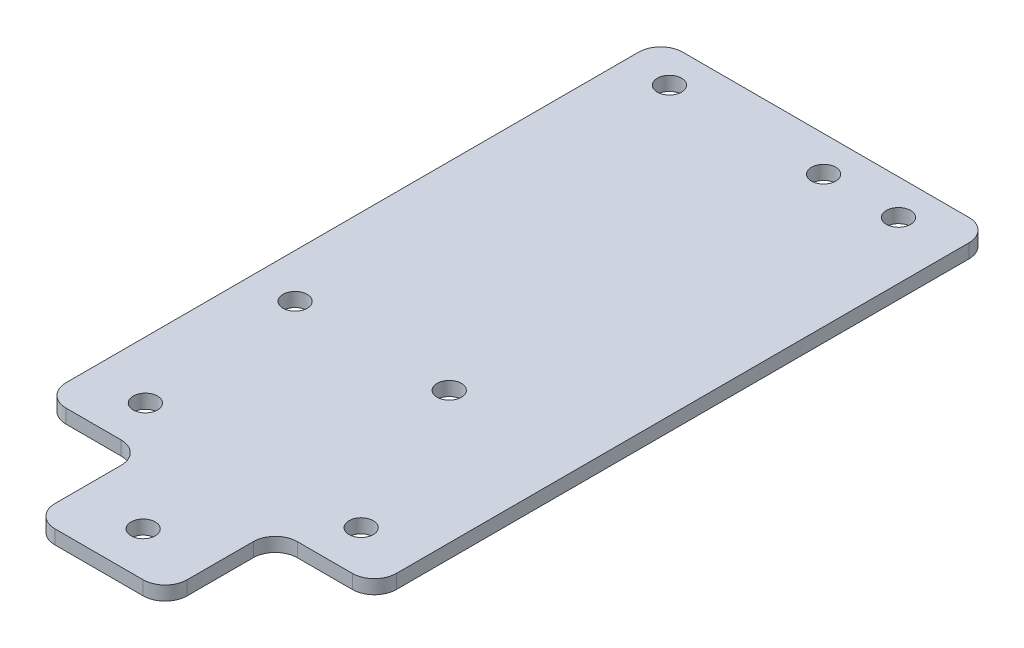
ISO-10303-21;
HEADER;
FILE_DESCRIPTION(('STEP AP214'),'2;1');
FILE_NAME('part.step','',(''),(''),'','','');
FILE_SCHEMA(('AUTOMOTIVE_DESIGN { 1 0 10303 214 1 1 1 1 }'));
ENDSEC;
DATA;
#1=APPLICATION_CONTEXT('core data for automotive mechanical design processes');
#2=APPLICATION_PROTOCOL_DEFINITION('international standard','automotive_design',2000,#1);
#3=PRODUCT_CONTEXT('',#1,'mechanical');
#4=PRODUCT('Part','Part','',(#3));
#5=PRODUCT_RELATED_PRODUCT_CATEGORY('part','',(#4));
#6=PRODUCT_DEFINITION_FORMATION('','',#4);
#7=PRODUCT_DEFINITION_CONTEXT('part definition',#1,'design');
#8=PRODUCT_DEFINITION('design','',#6,#7);
#9=PRODUCT_DEFINITION_SHAPE('','',#8);
#10=(LENGTH_UNIT() NAMED_UNIT(*) SI_UNIT(.MILLI.,.METRE.));
#11=(NAMED_UNIT(*) PLANE_ANGLE_UNIT() SI_UNIT($,.RADIAN.));
#12=(NAMED_UNIT(*) SI_UNIT($,.STERADIAN.) SOLID_ANGLE_UNIT());
#13=UNCERTAINTY_MEASURE_WITH_UNIT(LENGTH_MEASURE(1.E-05),#10,'distance_accuracy_value','');
#14=(GEOMETRIC_REPRESENTATION_CONTEXT(3) GLOBAL_UNCERTAINTY_ASSIGNED_CONTEXT((#13)) GLOBAL_UNIT_ASSIGNED_CONTEXT((#10,
#11,#12)) REPRESENTATION_CONTEXT('',''));
#15=CARTESIAN_POINT('',(0.,0.,0.));
#16=DIRECTION('',(0.,0.,1.));
#17=DIRECTION('',(1.,0.,0.));
#18=AXIS2_PLACEMENT_3D('',#15,#16,#17);
#19=CARTESIAN_POINT('',(70.,3.175,135.));
#20=DIRECTION('',(0.,1.,0.));
#21=DIRECTION('',(0.,0.,1.));
#22=AXIS2_PLACEMENT_3D('',#19,#20,#21);
#23=PLANE('',#22);
#24=CARTESIAN_POINT('',(62.,3.175,130.));
#25=DIRECTION('',(0.,1.,0.));
#26=DIRECTION('',(0.,0.,1.));
#27=AXIS2_PLACEMENT_3D('',#24,#25,#26);
#28=CIRCLE('',#27,2.75);
#29=CARTESIAN_POINT('',(62.,3.175,132.75));
#30=VERTEX_POINT('',#29);
#31=EDGE_CURVE('E368',#30,#30,#28,.T.);
#32=ORIENTED_EDGE('',*,*,#31,.F.);
#33=EDGE_LOOP('',(#32));
#34=FACE_BOUND('',#33,.T.);
#35=CARTESIAN_POINT('',(10.,3.175,93.));
#36=DIRECTION('',(0.,1.,0.));
#37=DIRECTION('',(0.,0.,-1.));
#38=AXIS2_PLACEMENT_3D('',#35,#36,#37);
#39=CIRCLE('',#38,2.75);
#40=CARTESIAN_POINT('',(10.,3.175,90.25));
#41=VERTEX_POINT('',#40);
#42=EDGE_CURVE('E381',#41,#41,#39,.T.);
#43=ORIENTED_EDGE('',*,*,#42,.F.);
#44=EDGE_LOOP('',(#43));
#45=FACE_BOUND('',#44,.T.);
#46=CARTESIAN_POINT('',(62.,3.175,8.));
#47=DIRECTION('',(0.,1.,0.));
#48=DIRECTION('',(0.,0.,1.));
#49=AXIS2_PLACEMENT_3D('',#46,#47,#48);
#50=CIRCLE('',#49,2.75000000000002);
#51=CARTESIAN_POINT('',(62.,3.175,10.75));
#52=VERTEX_POINT('',#51);
#53=EDGE_CURVE('E395',#52,#52,#50,.T.);
#54=ORIENTED_EDGE('',*,*,#53,.F.);
#55=EDGE_LOOP('',(#54));
#56=FACE_BOUND('',#55,.T.);
#57=CARTESIAN_POINT('',(10.,3.175,8.));
#58=DIRECTION('',(0.,1.,0.));
#59=DIRECTION('',(0.,0.,1.));
#60=AXIS2_PLACEMENT_3D('',#57,#58,#59);
#61=CIRCLE('',#60,2.75);
#62=CARTESIAN_POINT('',(10.,3.175,10.75));
#63=VERTEX_POINT('',#62);
#64=EDGE_CURVE('E188',#63,#63,#61,.T.);
#65=ORIENTED_EDGE('',*,*,#64,.F.);
#66=EDGE_LOOP('',(#65));
#67=FACE_BOUND('',#66,.T.);
#68=CARTESIAN_POINT('',(70.,3.175,135.));
#69=DIRECTION('',(0.,1.,0.));
#70=DIRECTION('',(0.,0.,1.));
#71=AXIS2_PLACEMENT_3D('',#68,#69,#70);
#72=CIRCLE('',#71,5.);
#73=CARTESIAN_POINT('',(70.,3.175,140.));
#74=VERTEX_POINT('',#73);
#75=CARTESIAN_POINT('',(75.,3.175,135.));
#76=VERTEX_POINT('',#75);
#77=EDGE_CURVE('E216',#74,#76,#72,.T.);
#78=ORIENTED_EDGE('',*,*,#77,.T.);
#79=DIRECTION('',(0.,0.,-1.));
#80=VECTOR('',#79,1.);
#81=CARTESIAN_POINT('',(75.,3.175,5.00000000000003));
#82=LINE('',#81,#80);
#83=CARTESIAN_POINT('',(75.,3.175,5.00000000000004));
#84=VERTEX_POINT('',#83);
#85=EDGE_CURVE('E123',#76,#84,#82,.T.);
#86=ORIENTED_EDGE('',*,*,#85,.T.);
#87=CARTESIAN_POINT('',(70.,3.175,5.));
#88=DIRECTION('',(0.,1.,0.));
#89=DIRECTION('',(0.,0.,-1.));
#90=AXIS2_PLACEMENT_3D('',#87,#88,#89);
#91=CIRCLE('',#90,5.);
#92=CARTESIAN_POINT('',(70.,3.175,0.));
#93=VERTEX_POINT('',#92);
#94=EDGE_CURVE('E255',#84,#93,#91,.T.);
#95=ORIENTED_EDGE('',*,*,#94,.T.);
#96=DIRECTION('',(-1.,0.,0.));
#97=VECTOR('',#96,1.);
#98=CARTESIAN_POINT('',(5.00000000000004,3.175,0.));
#99=LINE('',#98,#97);
#100=CARTESIAN_POINT('',(5.00000000000004,3.175,0.));
#101=VERTEX_POINT('',#100);
#102=EDGE_CURVE('E274',#93,#101,#99,.T.);
#103=ORIENTED_EDGE('',*,*,#102,.T.);
#104=CARTESIAN_POINT('',(5.,3.175,5.));
#105=DIRECTION('',(0.,1.,0.));
#106=DIRECTION('',(0.,0.,1.));
#107=AXIS2_PLACEMENT_3D('',#104,#105,#106);
#108=CIRCLE('',#107,5.);
#109=CARTESIAN_POINT('',(0.,3.175,5.00000000000004));
#110=VERTEX_POINT('',#109);
#111=EDGE_CURVE('E271',#101,#110,#108,.T.);
#112=ORIENTED_EDGE('',*,*,#111,.T.);
#113=DIRECTION('',(0.,0.,1.));
#114=VECTOR('',#113,1.);
#115=CARTESIAN_POINT('',(0.,3.175,5.00000000000004));
#116=LINE('',#115,#114);
#117=CARTESIAN_POINT('',(0.,3.175,135.));
#118=VERTEX_POINT('',#117);
#119=EDGE_CURVE('E273',#110,#118,#116,.T.);
#120=ORIENTED_EDGE('',*,*,#119,.T.);
#121=CARTESIAN_POINT('',(5.00000000000002,3.175,135.));
#122=DIRECTION('',(0.,1.,0.));
#123=DIRECTION('',(0.,0.,1.));
#124=AXIS2_PLACEMENT_3D('',#121,#122,#123);
#125=CIRCLE('',#124,5.);
#126=CARTESIAN_POINT('',(5.00000000000002,3.175,140.));
#127=VERTEX_POINT('',#126);
#128=EDGE_CURVE('E276',#118,#127,#125,.T.);
#129=ORIENTED_EDGE('',*,*,#128,.T.);
#130=DIRECTION('',(1.,0.,0.));
#131=VECTOR('',#130,1.);
#132=CARTESIAN_POINT('',(5.00000000000002,3.175,140.));
#133=LINE('',#132,#131);
#134=CARTESIAN_POINT('',(17.5,3.175,140.));
#135=VERTEX_POINT('',#134);
#136=EDGE_CURVE('E282',#127,#135,#133,.T.);
#137=ORIENTED_EDGE('',*,*,#136,.T.);
#138=CARTESIAN_POINT('',(17.5,3.175,145.));
#139=DIRECTION('',(0.,-1.,0.));
#140=DIRECTION('',(0.,0.,-1.));
#141=AXIS2_PLACEMENT_3D('',#138,#139,#140);
#142=CIRCLE('',#141,5.);
#143=CARTESIAN_POINT('',(22.5,3.175,145.));
#144=VERTEX_POINT('',#143);
#145=EDGE_CURVE('E284',#135,#144,#142,.T.);
#146=ORIENTED_EDGE('',*,*,#145,.T.);
#147=DIRECTION('',(0.,0.,1.));
#148=VECTOR('',#147,1.);
#149=CARTESIAN_POINT('',(22.5,3.175,145.));
#150=LINE('',#149,#148);
#151=CARTESIAN_POINT('',(22.5,3.175,160.));
#152=VERTEX_POINT('',#151);
#153=EDGE_CURVE('E286',#144,#152,#150,.T.);
#154=ORIENTED_EDGE('',*,*,#153,.T.);
#155=CARTESIAN_POINT('',(27.5,3.175,160.));
#156=DIRECTION('',(0.,1.,0.));
#157=DIRECTION('',(0.,0.,1.));
#158=AXIS2_PLACEMENT_3D('',#155,#156,#157);
#159=CIRCLE('',#158,5.);
#160=CARTESIAN_POINT('',(27.5,3.175,165.));
#161=VERTEX_POINT('',#160);
#162=EDGE_CURVE('E288',#152,#161,#159,.T.);
#163=ORIENTED_EDGE('',*,*,#162,.T.);
#164=DIRECTION('',(1.,0.,0.));
#165=VECTOR('',#164,1.);
#166=CARTESIAN_POINT('',(27.5,3.175,165.));
#167=LINE('',#166,#165);
#168=CARTESIAN_POINT('',(47.5,3.175,165.));
#169=VERTEX_POINT('',#168);
#170=EDGE_CURVE('E290',#161,#169,#167,.T.);
#171=ORIENTED_EDGE('',*,*,#170,.T.);
#172=CARTESIAN_POINT('',(47.5,3.175,160.));
#173=DIRECTION('',(0.,1.,0.));
#174=DIRECTION('',(0.,0.,1.));
#175=AXIS2_PLACEMENT_3D('',#172,#173,#174);
#176=CIRCLE('',#175,5.);
#177=CARTESIAN_POINT('',(52.5,3.175,160.));
#178=VERTEX_POINT('',#177);
#179=EDGE_CURVE('E166',#169,#178,#176,.T.);
#180=ORIENTED_EDGE('',*,*,#179,.T.);
#181=DIRECTION('',(0.,0.,-1.));
#182=VECTOR('',#181,1.);
#183=CARTESIAN_POINT('',(52.5,3.175,145.));
#184=LINE('',#183,#182);
#185=CARTESIAN_POINT('',(52.5,3.175,145.));
#186=VERTEX_POINT('',#185);
#187=EDGE_CURVE('E160',#178,#186,#184,.T.);
#188=ORIENTED_EDGE('',*,*,#187,.T.);
#189=CARTESIAN_POINT('',(57.5,3.175,145.));
#190=DIRECTION('',(0.,-1.,0.));
#191=DIRECTION('',(0.,0.,1.));
#192=AXIS2_PLACEMENT_3D('',#189,#190,#191);
#193=CIRCLE('',#192,5.);
#194=CARTESIAN_POINT('',(57.5,3.175,140.));
#195=VERTEX_POINT('',#194);
#196=EDGE_CURVE('E164',#186,#195,#193,.T.);
#197=ORIENTED_EDGE('',*,*,#196,.T.);
#198=DIRECTION('',(1.,0.,0.));
#199=VECTOR('',#198,1.);
#200=CARTESIAN_POINT('',(57.5,3.175,140.));
#201=LINE('',#200,#199);
#202=EDGE_CURVE('E56',#195,#74,#201,.T.);
#203=ORIENTED_EDGE('',*,*,#202,.T.);
#204=EDGE_LOOP('',(#78,#86,#95,#103,#112,#120,#129,#137,#146,#154,#163,#171,#180,#188,#197,#203));
#205=FACE_BOUND('',#204,.T.);
#206=CARTESIAN_POINT('',(45.,3.175,8.));
#207=DIRECTION('',(0.,1.,0.));
#208=DIRECTION('',(0.,0.,1.));
#209=AXIS2_PLACEMENT_3D('',#206,#207,#208);
#210=CIRCLE('',#209,2.75);
#211=CARTESIAN_POINT('',(45.,3.175,10.75));
#212=VERTEX_POINT('',#211);
#213=EDGE_CURVE('E402',#212,#212,#210,.T.);
#214=ORIENTED_EDGE('',*,*,#213,.F.);
#215=EDGE_LOOP('',(#214));
#216=FACE_BOUND('',#215,.T.);
#217=CARTESIAN_POINT('',(45.,3.175,93.));
#218=DIRECTION('',(0.,1.,0.));
#219=DIRECTION('',(0.,0.,-1.));
#220=AXIS2_PLACEMENT_3D('',#217,#218,#219);
#221=CIRCLE('',#220,2.75);
#222=CARTESIAN_POINT('',(45.,3.175,90.25));
#223=VERTEX_POINT('',#222);
#224=EDGE_CURVE('E388',#223,#223,#221,.T.);
#225=ORIENTED_EDGE('',*,*,#224,.F.);
#226=EDGE_LOOP('',(#225));
#227=FACE_BOUND('',#226,.T.);
#228=CARTESIAN_POINT('',(37.5,3.175,155.));
#229=DIRECTION('',(0.,1.,0.));
#230=DIRECTION('',(0.,0.,1.));
#231=AXIS2_PLACEMENT_3D('',#228,#229,#230);
#232=CIRCLE('',#231,2.75);
#233=CARTESIAN_POINT('',(37.5,3.175,157.75));
#234=VERTEX_POINT('',#233);
#235=EDGE_CURVE('E375',#234,#234,#232,.T.);
#236=ORIENTED_EDGE('',*,*,#235,.F.);
#237=EDGE_LOOP('',(#236));
#238=FACE_BOUND('',#237,.T.);
#239=CARTESIAN_POINT('',(13.,3.175,130.));
#240=DIRECTION('',(0.,1.,0.));
#241=DIRECTION('',(0.,0.,1.));
#242=AXIS2_PLACEMENT_3D('',#239,#240,#241);
#243=CIRCLE('',#242,2.75);
#244=CARTESIAN_POINT('',(13.,3.175,132.75));
#245=VERTEX_POINT('',#244);
#246=EDGE_CURVE('E357',#245,#245,#243,.T.);
#247=ORIENTED_EDGE('',*,*,#246,.F.);
#248=EDGE_LOOP('',(#247));
#249=FACE_BOUND('',#248,.T.);
#250=ADVANCED_FACE('F39',(#34,#45,#56,#67,#205,#216,#227,#238,#249),#23,.T.);
#251=CARTESIAN_POINT('',(70.,0.,135.));
#252=DIRECTION('',(0.,1.,0.));
#253=DIRECTION('',(0.,0.,1.));
#254=AXIS2_PLACEMENT_3D('',#251,#252,#253);
#255=PLANE('',#254);
#256=CARTESIAN_POINT('',(70.,0.,135.));
#257=DIRECTION('',(0.,1.,0.));
#258=DIRECTION('',(0.,0.,1.));
#259=AXIS2_PLACEMENT_3D('',#256,#257,#258);
#260=CIRCLE('',#259,5.);
#261=CARTESIAN_POINT('',(70.,0.,140.));
#262=VERTEX_POINT('',#261);
#263=CARTESIAN_POINT('',(75.,0.,135.));
#264=VERTEX_POINT('',#263);
#265=EDGE_CURVE('E184',#262,#264,#260,.T.);
#266=ORIENTED_EDGE('',*,*,#265,.F.);
#267=DIRECTION('',(1.,0.,0.));
#268=VECTOR('',#267,1.);
#269=CARTESIAN_POINT('',(57.5,0.,140.));
#270=LINE('',#269,#268);
#271=CARTESIAN_POINT('',(57.5,0.,140.));
#272=VERTEX_POINT('',#271);
#273=EDGE_CURVE('E115',#272,#262,#270,.T.);
#274=ORIENTED_EDGE('',*,*,#273,.F.);
#275=CARTESIAN_POINT('',(57.5,0.,145.));
#276=DIRECTION('',(0.,-1.,0.));
#277=DIRECTION('',(0.,0.,1.));
#278=AXIS2_PLACEMENT_3D('',#275,#276,#277);
#279=CIRCLE('',#278,5.);
#280=CARTESIAN_POINT('',(52.5,0.,145.));
#281=VERTEX_POINT('',#280);
#282=EDGE_CURVE('E109',#281,#272,#279,.T.);
#283=ORIENTED_EDGE('',*,*,#282,.F.);
#284=DIRECTION('',(0.,0.,-1.));
#285=VECTOR('',#284,1.);
#286=CARTESIAN_POINT('',(52.5,0.,145.));
#287=LINE('',#286,#285);
#288=CARTESIAN_POINT('',(52.5,0.,160.));
#289=VERTEX_POINT('',#288);
#290=EDGE_CURVE('E174',#289,#281,#287,.T.);
#291=ORIENTED_EDGE('',*,*,#290,.F.);
#292=CARTESIAN_POINT('',(47.5,0.,160.));
#293=DIRECTION('',(0.,1.,0.));
#294=DIRECTION('',(0.,0.,1.));
#295=AXIS2_PLACEMENT_3D('',#292,#293,#294);
#296=CIRCLE('',#295,5.);
#297=CARTESIAN_POINT('',(47.5,0.,165.));
#298=VERTEX_POINT('',#297);
#299=EDGE_CURVE('E211',#298,#289,#296,.T.);
#300=ORIENTED_EDGE('',*,*,#299,.F.);
#301=DIRECTION('',(1.,0.,0.));
#302=VECTOR('',#301,1.);
#303=CARTESIAN_POINT('',(27.5,0.,165.));
#304=LINE('',#303,#302);
#305=CARTESIAN_POINT('',(27.5,0.,165.));
#306=VERTEX_POINT('',#305);
#307=EDGE_CURVE('E209',#306,#298,#304,.T.);
#308=ORIENTED_EDGE('',*,*,#307,.F.);
#309=CARTESIAN_POINT('',(27.5,0.,160.));
#310=DIRECTION('',(0.,1.,0.));
#311=DIRECTION('',(0.,0.,1.));
#312=AXIS2_PLACEMENT_3D('',#309,#310,#311);
#313=CIRCLE('',#312,5.);
#314=CARTESIAN_POINT('',(22.5,0.,160.));
#315=VERTEX_POINT('',#314);
#316=EDGE_CURVE('E207',#315,#306,#313,.T.);
#317=ORIENTED_EDGE('',*,*,#316,.F.);
#318=DIRECTION('',(0.,0.,1.));
#319=VECTOR('',#318,1.);
#320=CARTESIAN_POINT('',(22.5,0.,145.));
#321=LINE('',#320,#319);
#322=CARTESIAN_POINT('',(22.5,0.,145.));
#323=VERTEX_POINT('',#322);
#324=EDGE_CURVE('E205',#323,#315,#321,.T.);
#325=ORIENTED_EDGE('',*,*,#324,.F.);
#326=CARTESIAN_POINT('',(17.5,0.,145.));
#327=DIRECTION('',(0.,-1.,0.));
#328=DIRECTION('',(0.,0.,-1.));
#329=AXIS2_PLACEMENT_3D('',#326,#327,#328);
#330=CIRCLE('',#329,5.);
#331=CARTESIAN_POINT('',(17.5,0.,140.));
#332=VERTEX_POINT('',#331);
#333=EDGE_CURVE('E203',#332,#323,#330,.T.);
#334=ORIENTED_EDGE('',*,*,#333,.F.);
#335=DIRECTION('',(1.,0.,0.));
#336=VECTOR('',#335,1.);
#337=CARTESIAN_POINT('',(5.00000000000002,0.,140.));
#338=LINE('',#337,#336);
#339=CARTESIAN_POINT('',(5.00000000000002,0.,140.));
#340=VERTEX_POINT('',#339);
#341=EDGE_CURVE('E199',#340,#332,#338,.T.);
#342=ORIENTED_EDGE('',*,*,#341,.F.);
#343=CARTESIAN_POINT('',(5.00000000000002,0.,135.));
#344=DIRECTION('',(0.,1.,0.));
#345=DIRECTION('',(0.,0.,1.));
#346=AXIS2_PLACEMENT_3D('',#343,#344,#345);
#347=CIRCLE('',#346,5.);
#348=CARTESIAN_POINT('',(0.,0.,135.));
#349=VERTEX_POINT('',#348);
#350=EDGE_CURVE('E198',#349,#340,#347,.T.);
#351=ORIENTED_EDGE('',*,*,#350,.F.);
#352=DIRECTION('',(0.,0.,1.));
#353=VECTOR('',#352,1.);
#354=CARTESIAN_POINT('',(0.,0.,5.00000000000004));
#355=LINE('',#354,#353);
#356=CARTESIAN_POINT('',(0.,0.,5.00000000000004));
#357=VERTEX_POINT('',#356);
#358=EDGE_CURVE('E196',#357,#349,#355,.T.);
#359=ORIENTED_EDGE('',*,*,#358,.F.);
#360=CARTESIAN_POINT('',(5.,0.,5.));
#361=DIRECTION('',(0.,1.,0.));
#362=DIRECTION('',(0.,0.,1.));
#363=AXIS2_PLACEMENT_3D('',#360,#361,#362);
#364=CIRCLE('',#363,5.);
#365=CARTESIAN_POINT('',(5.00000000000004,0.,0.));
#366=VERTEX_POINT('',#365);
#367=EDGE_CURVE('E194',#366,#357,#364,.T.);
#368=ORIENTED_EDGE('',*,*,#367,.F.);
#369=DIRECTION('',(-1.,0.,0.));
#370=VECTOR('',#369,1.);
#371=CARTESIAN_POINT('',(5.00000000000004,0.,0.));
#372=LINE('',#371,#370);
#373=CARTESIAN_POINT('',(70.,0.,0.));
#374=VERTEX_POINT('',#373);
#375=EDGE_CURVE('E192',#374,#366,#372,.T.);
#376=ORIENTED_EDGE('',*,*,#375,.F.);
#377=CARTESIAN_POINT('',(70.,0.,5.));
#378=DIRECTION('',(0.,1.,0.));
#379=DIRECTION('',(0.,0.,-1.));
#380=AXIS2_PLACEMENT_3D('',#377,#378,#379);
#381=CIRCLE('',#380,5.);
#382=CARTESIAN_POINT('',(75.,0.,5.00000000000004));
#383=VERTEX_POINT('',#382);
#384=EDGE_CURVE('E190',#383,#374,#381,.T.);
#385=ORIENTED_EDGE('',*,*,#384,.F.);
#386=DIRECTION('',(0.,0.,-1.));
#387=VECTOR('',#386,1.);
#388=CARTESIAN_POINT('',(75.,0.,5.00000000000003));
#389=LINE('',#388,#387);
#390=EDGE_CURVE('E187',#264,#383,#389,.T.);
#391=ORIENTED_EDGE('',*,*,#390,.F.);
#392=EDGE_LOOP('',(#266,#274,#283,#291,#300,#308,#317,#325,#334,#342,#351,#359,#368,#376,#385,#391));
#393=FACE_BOUND('',#392,.T.);
#394=CARTESIAN_POINT('',(10.,0.,8.));
#395=DIRECTION('',(0.,1.,0.));
#396=DIRECTION('',(0.,0.,1.));
#397=AXIS2_PLACEMENT_3D('',#394,#395,#396);
#398=CIRCLE('',#397,2.75);
#399=CARTESIAN_POINT('',(10.,0.,10.75));
#400=VERTEX_POINT('',#399);
#401=EDGE_CURVE('E405',#400,#400,#398,.T.);
#402=ORIENTED_EDGE('',*,*,#401,.T.);
#403=EDGE_LOOP('',(#402));
#404=FACE_BOUND('',#403,.T.);
#405=CARTESIAN_POINT('',(45.,0.,8.));
#406=DIRECTION('',(0.,1.,0.));
#407=DIRECTION('',(0.,0.,1.));
#408=AXIS2_PLACEMENT_3D('',#405,#406,#407);
#409=CIRCLE('',#408,2.75);
#410=CARTESIAN_POINT('',(45.,0.,10.75));
#411=VERTEX_POINT('',#410);
#412=EDGE_CURVE('E398',#411,#411,#409,.T.);
#413=ORIENTED_EDGE('',*,*,#412,.T.);
#414=EDGE_LOOP('',(#413));
#415=FACE_BOUND('',#414,.T.);
#416=CARTESIAN_POINT('',(62.,0.,8.));
#417=DIRECTION('',(0.,1.,0.));
#418=DIRECTION('',(0.,0.,1.));
#419=AXIS2_PLACEMENT_3D('',#416,#417,#418);
#420=CIRCLE('',#419,2.75000000000002);
#421=CARTESIAN_POINT('',(62.,0.,10.75));
#422=VERTEX_POINT('',#421);
#423=EDGE_CURVE('E391',#422,#422,#420,.T.);
#424=ORIENTED_EDGE('',*,*,#423,.T.);
#425=EDGE_LOOP('',(#424));
#426=FACE_BOUND('',#425,.T.);
#427=CARTESIAN_POINT('',(45.,0.,93.));
#428=DIRECTION('',(0.,1.,0.));
#429=DIRECTION('',(0.,0.,-1.));
#430=AXIS2_PLACEMENT_3D('',#427,#428,#429);
#431=CIRCLE('',#430,2.75);
#432=CARTESIAN_POINT('',(45.,0.,90.25));
#433=VERTEX_POINT('',#432);
#434=EDGE_CURVE('E384',#433,#433,#431,.T.);
#435=ORIENTED_EDGE('',*,*,#434,.T.);
#436=EDGE_LOOP('',(#435));
#437=FACE_BOUND('',#436,.T.);
#438=CARTESIAN_POINT('',(10.,0.,93.));
#439=DIRECTION('',(0.,1.,0.));
#440=DIRECTION('',(0.,0.,-1.));
#441=AXIS2_PLACEMENT_3D('',#438,#439,#440);
#442=CIRCLE('',#441,2.75);
#443=CARTESIAN_POINT('',(10.,0.,90.25));
#444=VERTEX_POINT('',#443);
#445=EDGE_CURVE('E378',#444,#444,#442,.T.);
#446=ORIENTED_EDGE('',*,*,#445,.T.);
#447=EDGE_LOOP('',(#446));
#448=FACE_BOUND('',#447,.T.);
#449=CARTESIAN_POINT('',(37.5,0.,155.));
#450=DIRECTION('',(0.,1.,0.));
#451=DIRECTION('',(0.,0.,1.));
#452=AXIS2_PLACEMENT_3D('',#449,#450,#451);
#453=CIRCLE('',#452,2.75);
#454=CARTESIAN_POINT('',(37.5,0.,157.75));
#455=VERTEX_POINT('',#454);
#456=EDGE_CURVE('E371',#455,#455,#453,.T.);
#457=ORIENTED_EDGE('',*,*,#456,.T.);
#458=EDGE_LOOP('',(#457));
#459=FACE_BOUND('',#458,.T.);
#460=CARTESIAN_POINT('',(62.,0.,130.));
#461=DIRECTION('',(0.,1.,0.));
#462=DIRECTION('',(0.,0.,1.));
#463=AXIS2_PLACEMENT_3D('',#460,#461,#462);
#464=CIRCLE('',#463,2.75);
#465=CARTESIAN_POINT('',(62.,0.,132.75));
#466=VERTEX_POINT('',#465);
#467=EDGE_CURVE('E365',#466,#466,#464,.T.);
#468=ORIENTED_EDGE('',*,*,#467,.T.);
#469=EDGE_LOOP('',(#468));
#470=FACE_BOUND('',#469,.T.);
#471=CARTESIAN_POINT('',(13.,0.,130.));
#472=DIRECTION('',(0.,1.,0.));
#473=DIRECTION('',(0.,0.,1.));
#474=AXIS2_PLACEMENT_3D('',#471,#472,#473);
#475=CIRCLE('',#474,2.75);
#476=CARTESIAN_POINT('',(13.,0.,132.75));
#477=VERTEX_POINT('',#476);
#478=EDGE_CURVE('E360',#477,#477,#475,.T.);
#479=ORIENTED_EDGE('',*,*,#478,.T.);
#480=EDGE_LOOP('',(#479));
#481=FACE_BOUND('',#480,.T.);
#482=ADVANCED_FACE('F259',(#393,#404,#415,#426,#437,#448,#459,#470,#481),#255,.F.);
#483=CARTESIAN_POINT('',(70.,3.175,135.));
#484=DIRECTION('',(0.,-1.,0.));
#485=DIRECTION('',(0.,0.,-1.));
#486=AXIS2_PLACEMENT_3D('',#483,#484,#485);
#487=CYLINDRICAL_SURFACE('',#486,5.);
#488=ORIENTED_EDGE('',*,*,#265,.T.);
#489=DIRECTION('',(0.,-1.,0.));
#490=VECTOR('',#489,1.);
#491=CARTESIAN_POINT('',(75.,3.175,135.));
#492=LINE('',#491,#490);
#493=EDGE_CURVE('E12',#76,#264,#492,.T.);
#494=ORIENTED_EDGE('',*,*,#493,.F.);
#495=ORIENTED_EDGE('',*,*,#77,.F.);
#496=DIRECTION('',(0.,-1.,0.));
#497=VECTOR('',#496,1.);
#498=CARTESIAN_POINT('',(70.,3.175,140.));
#499=LINE('',#498,#497);
#500=EDGE_CURVE('E180',#74,#262,#499,.T.);
#501=ORIENTED_EDGE('',*,*,#500,.T.);
#502=EDGE_LOOP('',(#488,#494,#495,#501));
#503=FACE_BOUND('',#502,.T.);
#504=ADVANCED_FACE('F41',(#503),#487,.T.);
#505=CARTESIAN_POINT('',(75.,3.175,5.00000000000003));
#506=DIRECTION('',(-1.,0.,0.));
#507=DIRECTION('',(0.,0.,1.));
#508=AXIS2_PLACEMENT_3D('',#505,#506,#507);
#509=PLANE('',#508);
#510=ORIENTED_EDGE('',*,*,#390,.T.);
#511=DIRECTION('',(0.,-1.,0.));
#512=VECTOR('',#511,1.);
#513=CARTESIAN_POINT('',(75.,3.175,5.00000000000004));
#514=LINE('',#513,#512);
#515=EDGE_CURVE('E48',#84,#383,#514,.T.);
#516=ORIENTED_EDGE('',*,*,#515,.F.);
#517=ORIENTED_EDGE('',*,*,#85,.F.);
#518=ORIENTED_EDGE('',*,*,#493,.T.);
#519=EDGE_LOOP('',(#510,#516,#517,#518));
#520=FACE_BOUND('',#519,.T.);
#521=ADVANCED_FACE('F593',(#520),#509,.F.);
#522=CARTESIAN_POINT('',(70.,3.175,5.));
#523=DIRECTION('',(0.,-1.,0.));
#524=DIRECTION('',(0.,0.,-1.));
#525=AXIS2_PLACEMENT_3D('',#522,#523,#524);
#526=CYLINDRICAL_SURFACE('',#525,5.);
#527=ORIENTED_EDGE('',*,*,#384,.T.);
#528=DIRECTION('',(0.,-1.,0.));
#529=VECTOR('',#528,1.);
#530=CARTESIAN_POINT('',(70.,3.175,0.));
#531=LINE('',#530,#529);
#532=EDGE_CURVE('E247',#93,#374,#531,.T.);
#533=ORIENTED_EDGE('',*,*,#532,.F.);
#534=ORIENTED_EDGE('',*,*,#94,.F.);
#535=ORIENTED_EDGE('',*,*,#515,.T.);
#536=EDGE_LOOP('',(#527,#533,#534,#535));
#537=FACE_BOUND('',#536,.T.);
#538=ADVANCED_FACE('F253',(#537),#526,.T.);
#539=CARTESIAN_POINT('',(5.00000000000004,3.175,0.));
#540=DIRECTION('',(0.,0.,1.));
#541=DIRECTION('',(1.,0.,0.));
#542=AXIS2_PLACEMENT_3D('',#539,#540,#541);
#543=PLANE('',#542);
#544=ORIENTED_EDGE('',*,*,#375,.T.);
#545=DIRECTION('',(0.,-1.,0.));
#546=VECTOR('',#545,1.);
#547=CARTESIAN_POINT('',(5.00000000000004,3.175,0.));
#548=LINE('',#547,#546);
#549=EDGE_CURVE('E244',#101,#366,#548,.T.);
#550=ORIENTED_EDGE('',*,*,#549,.F.);
#551=ORIENTED_EDGE('',*,*,#102,.F.);
#552=ORIENTED_EDGE('',*,*,#532,.T.);
#553=EDGE_LOOP('',(#544,#550,#551,#552));
#554=FACE_BOUND('',#553,.T.);
#555=ADVANCED_FACE('F265',(#554),#543,.F.);
#556=CARTESIAN_POINT('',(5.,3.175,5.));
#557=DIRECTION('',(0.,-1.,0.));
#558=DIRECTION('',(0.,0.,-1.));
#559=AXIS2_PLACEMENT_3D('',#556,#557,#558);
#560=CYLINDRICAL_SURFACE('',#559,5.);
#561=ORIENTED_EDGE('',*,*,#367,.T.);
#562=DIRECTION('',(0.,-1.,0.));
#563=VECTOR('',#562,1.);
#564=CARTESIAN_POINT('',(0.,3.175,5.00000000000004));
#565=LINE('',#564,#563);
#566=EDGE_CURVE('E241',#110,#357,#565,.T.);
#567=ORIENTED_EDGE('',*,*,#566,.F.);
#568=ORIENTED_EDGE('',*,*,#111,.F.);
#569=ORIENTED_EDGE('',*,*,#549,.T.);
#570=EDGE_LOOP('',(#561,#567,#568,#569));
#571=FACE_BOUND('',#570,.T.);
#572=ADVANCED_FACE('F269',(#571),#560,.T.);
#573=CARTESIAN_POINT('',(0.,3.175,5.00000000000004));
#574=DIRECTION('',(1.,0.,0.));
#575=DIRECTION('',(0.,0.,-1.));
#576=AXIS2_PLACEMENT_3D('',#573,#574,#575);
#577=PLANE('',#576);
#578=ORIENTED_EDGE('',*,*,#358,.T.);
#579=DIRECTION('',(0.,-1.,0.));
#580=VECTOR('',#579,1.);
#581=CARTESIAN_POINT('',(0.,3.175,135.));
#582=LINE('',#581,#580);
#583=EDGE_CURVE('E238',#118,#349,#582,.T.);
#584=ORIENTED_EDGE('',*,*,#583,.F.);
#585=ORIENTED_EDGE('',*,*,#119,.F.);
#586=ORIENTED_EDGE('',*,*,#566,.T.);
#587=EDGE_LOOP('',(#578,#584,#585,#586));
#588=FACE_BOUND('',#587,.T.);
#589=ADVANCED_FACE('F558',(#588),#577,.F.);
#590=CARTESIAN_POINT('',(5.00000000000002,3.175,135.));
#591=DIRECTION('',(0.,-1.,0.));
#592=DIRECTION('',(0.,0.,-1.));
#593=AXIS2_PLACEMENT_3D('',#590,#591,#592);
#594=CYLINDRICAL_SURFACE('',#593,5.);
#595=ORIENTED_EDGE('',*,*,#350,.T.);
#596=DIRECTION('',(0.,-1.,0.));
#597=VECTOR('',#596,1.);
#598=CARTESIAN_POINT('',(5.00000000000002,3.175,140.));
#599=LINE('',#598,#597);
#600=EDGE_CURVE('E235',#127,#340,#599,.T.);
#601=ORIENTED_EDGE('',*,*,#600,.F.);
#602=ORIENTED_EDGE('',*,*,#128,.F.);
#603=ORIENTED_EDGE('',*,*,#583,.T.);
#604=EDGE_LOOP('',(#595,#601,#602,#603));
#605=FACE_BOUND('',#604,.T.);
#606=ADVANCED_FACE('F548',(#605),#594,.T.);
#607=CARTESIAN_POINT('',(5.00000000000002,3.175,140.));
#608=DIRECTION('',(0.,0.,-1.));
#609=DIRECTION('',(-1.,0.,0.));
#610=AXIS2_PLACEMENT_3D('',#607,#608,#609);
#611=PLANE('',#610);
#612=ORIENTED_EDGE('',*,*,#341,.T.);
#613=DIRECTION('',(0.,-1.,0.));
#614=VECTOR('',#613,1.);
#615=CARTESIAN_POINT('',(17.5,3.175,140.));
#616=LINE('',#615,#614);
#617=EDGE_CURVE('E232',#135,#332,#616,.T.);
#618=ORIENTED_EDGE('',*,*,#617,.F.);
#619=ORIENTED_EDGE('',*,*,#136,.F.);
#620=ORIENTED_EDGE('',*,*,#600,.T.);
#621=EDGE_LOOP('',(#612,#618,#619,#620));
#622=FACE_BOUND('',#621,.T.);
#623=ADVANCED_FACE('F538',(#622),#611,.F.);
#624=CARTESIAN_POINT('',(17.5,3.175,145.));
#625=DIRECTION('',(0.,-1.,0.));
#626=DIRECTION('',(0.,0.,-1.));
#627=AXIS2_PLACEMENT_3D('',#624,#625,#626);
#628=CYLINDRICAL_SURFACE('',#627,5.);
#629=ORIENTED_EDGE('',*,*,#333,.T.);
#630=DIRECTION('',(0.,-1.,0.));
#631=VECTOR('',#630,1.);
#632=CARTESIAN_POINT('',(22.5,3.175,145.));
#633=LINE('',#632,#631);
#634=EDGE_CURVE('E229',#144,#323,#633,.T.);
#635=ORIENTED_EDGE('',*,*,#634,.F.);
#636=ORIENTED_EDGE('',*,*,#145,.F.);
#637=ORIENTED_EDGE('',*,*,#617,.T.);
#638=EDGE_LOOP('',(#629,#635,#636,#637));
#639=FACE_BOUND('',#638,.T.);
#640=ADVANCED_FACE('F528',(#639),#628,.F.);
#641=CARTESIAN_POINT('',(22.5,3.175,145.));
#642=DIRECTION('',(1.,0.,0.));
#643=DIRECTION('',(0.,0.,-1.));
#644=AXIS2_PLACEMENT_3D('',#641,#642,#643);
#645=PLANE('',#644);
#646=ORIENTED_EDGE('',*,*,#324,.T.);
#647=DIRECTION('',(0.,-1.,0.));
#648=VECTOR('',#647,1.);
#649=CARTESIAN_POINT('',(22.5,3.175,160.));
#650=LINE('',#649,#648);
#651=EDGE_CURVE('E226',#152,#315,#650,.T.);
#652=ORIENTED_EDGE('',*,*,#651,.F.);
#653=ORIENTED_EDGE('',*,*,#153,.F.);
#654=ORIENTED_EDGE('',*,*,#634,.T.);
#655=EDGE_LOOP('',(#646,#652,#653,#654));
#656=FACE_BOUND('',#655,.T.);
#657=ADVANCED_FACE('F518',(#656),#645,.F.);
#658=CARTESIAN_POINT('',(27.5,3.175,160.));
#659=DIRECTION('',(0.,-1.,0.));
#660=DIRECTION('',(0.,0.,-1.));
#661=AXIS2_PLACEMENT_3D('',#658,#659,#660);
#662=CYLINDRICAL_SURFACE('',#661,5.);
#663=ORIENTED_EDGE('',*,*,#316,.T.);
#664=DIRECTION('',(0.,-1.,0.));
#665=VECTOR('',#664,1.);
#666=CARTESIAN_POINT('',(27.5,3.175,165.));
#667=LINE('',#666,#665);
#668=EDGE_CURVE('E223',#161,#306,#667,.T.);
#669=ORIENTED_EDGE('',*,*,#668,.F.);
#670=ORIENTED_EDGE('',*,*,#162,.F.);
#671=ORIENTED_EDGE('',*,*,#651,.T.);
#672=EDGE_LOOP('',(#663,#669,#670,#671));
#673=FACE_BOUND('',#672,.T.);
#674=ADVANCED_FACE('F509',(#673),#662,.T.);
#675=CARTESIAN_POINT('',(27.5,3.175,165.));
#676=DIRECTION('',(0.,0.,-1.));
#677=DIRECTION('',(-1.,0.,0.));
#678=AXIS2_PLACEMENT_3D('',#675,#676,#677);
#679=PLANE('',#678);
#680=ORIENTED_EDGE('',*,*,#307,.T.);
#681=DIRECTION('',(0.,-1.,0.));
#682=VECTOR('',#681,1.);
#683=CARTESIAN_POINT('',(47.5,3.175,165.));
#684=LINE('',#683,#682);
#685=EDGE_CURVE('E220',#169,#298,#684,.T.);
#686=ORIENTED_EDGE('',*,*,#685,.F.);
#687=ORIENTED_EDGE('',*,*,#170,.F.);
#688=ORIENTED_EDGE('',*,*,#668,.T.);
#689=EDGE_LOOP('',(#680,#686,#687,#688));
#690=FACE_BOUND('',#689,.T.);
#691=ADVANCED_FACE('F296',(#690),#679,.F.);
#692=CARTESIAN_POINT('',(47.5,3.175,160.));
#693=DIRECTION('',(0.,-1.,0.));
#694=DIRECTION('',(0.,0.,-1.));
#695=AXIS2_PLACEMENT_3D('',#692,#693,#694);
#696=CYLINDRICAL_SURFACE('',#695,5.);
#697=ORIENTED_EDGE('',*,*,#299,.T.);
#698=DIRECTION('',(0.,-1.,0.));
#699=VECTOR('',#698,1.);
#700=CARTESIAN_POINT('',(52.5,3.175,160.));
#701=LINE('',#700,#699);
#702=EDGE_CURVE('E175',#178,#289,#701,.T.);
#703=ORIENTED_EDGE('',*,*,#702,.F.);
#704=ORIENTED_EDGE('',*,*,#179,.F.);
#705=ORIENTED_EDGE('',*,*,#685,.T.);
#706=EDGE_LOOP('',(#697,#703,#704,#705));
#707=FACE_BOUND('',#706,.T.);
#708=ADVANCED_FACE('F300',(#707),#696,.T.);
#709=CARTESIAN_POINT('',(52.5,3.175,145.));
#710=DIRECTION('',(-1.,0.,0.));
#711=DIRECTION('',(0.,0.,1.));
#712=AXIS2_PLACEMENT_3D('',#709,#710,#711);
#713=PLANE('',#712);
#714=ORIENTED_EDGE('',*,*,#290,.T.);
#715=DIRECTION('',(0.,-1.,0.));
#716=VECTOR('',#715,1.);
#717=CARTESIAN_POINT('',(52.5,3.175,145.));
#718=LINE('',#717,#716);
#719=EDGE_CURVE('E171',#186,#281,#718,.T.);
#720=ORIENTED_EDGE('',*,*,#719,.F.);
#721=ORIENTED_EDGE('',*,*,#187,.F.);
#722=ORIENTED_EDGE('',*,*,#702,.T.);
#723=EDGE_LOOP('',(#714,#720,#721,#722));
#724=FACE_BOUND('',#723,.T.);
#725=ADVANCED_FACE('F172',(#724),#713,.F.);
#726=CARTESIAN_POINT('',(57.5,3.175,145.));
#727=DIRECTION('',(0.,-1.,0.));
#728=DIRECTION('',(0.,0.,-1.));
#729=AXIS2_PLACEMENT_3D('',#726,#727,#728);
#730=CYLINDRICAL_SURFACE('',#729,5.);
#731=ORIENTED_EDGE('',*,*,#282,.T.);
#732=DIRECTION('',(0.,-1.,0.));
#733=VECTOR('',#732,1.);
#734=CARTESIAN_POINT('',(57.5,3.175,140.));
#735=LINE('',#734,#733);
#736=EDGE_CURVE('E176',#195,#272,#735,.T.);
#737=ORIENTED_EDGE('',*,*,#736,.F.);
#738=ORIENTED_EDGE('',*,*,#196,.F.);
#739=ORIENTED_EDGE('',*,*,#719,.T.);
#740=EDGE_LOOP('',(#731,#737,#738,#739));
#741=FACE_BOUND('',#740,.T.);
#742=ADVANCED_FACE('F178',(#741),#730,.F.);
#743=CARTESIAN_POINT('',(57.5,3.175,140.));
#744=DIRECTION('',(0.,0.,-1.));
#745=DIRECTION('',(-1.,0.,0.));
#746=AXIS2_PLACEMENT_3D('',#743,#744,#745);
#747=PLANE('',#746);
#748=ORIENTED_EDGE('',*,*,#273,.T.);
#749=ORIENTED_EDGE('',*,*,#500,.F.);
#750=ORIENTED_EDGE('',*,*,#202,.F.);
#751=ORIENTED_EDGE('',*,*,#736,.T.);
#752=EDGE_LOOP('',(#748,#749,#750,#751));
#753=FACE_BOUND('',#752,.T.);
#754=ADVANCED_FACE('F304',(#753),#747,.F.);
#755=CARTESIAN_POINT('',(10.,3.175,8.));
#756=DIRECTION('',(0.,-1.,0.));
#757=DIRECTION('',(0.,0.,-1.));
#758=AXIS2_PLACEMENT_3D('',#755,#756,#757);
#759=CYLINDRICAL_SURFACE('',#758,2.75);
#760=ORIENTED_EDGE('',*,*,#64,.T.);
#761=EDGE_LOOP('',(#760));
#762=FACE_BOUND('',#761,.T.);
#763=ORIENTED_EDGE('',*,*,#401,.F.);
#764=EDGE_LOOP('',(#763));
#765=FACE_BOUND('',#764,.T.);
#766=ADVANCED_FACE('F306',(#762,#765),#759,.F.);
#767=CARTESIAN_POINT('',(45.,3.175,8.));
#768=DIRECTION('',(0.,-1.,0.));
#769=DIRECTION('',(0.,0.,-1.));
#770=AXIS2_PLACEMENT_3D('',#767,#768,#769);
#771=CYLINDRICAL_SURFACE('',#770,2.75);
#772=ORIENTED_EDGE('',*,*,#213,.T.);
#773=EDGE_LOOP('',(#772));
#774=FACE_BOUND('',#773,.T.);
#775=ORIENTED_EDGE('',*,*,#412,.F.);
#776=EDGE_LOOP('',(#775));
#777=FACE_BOUND('',#776,.T.);
#778=ADVANCED_FACE('F312',(#774,#777),#771,.F.);
#779=CARTESIAN_POINT('',(62.,3.175,8.));
#780=DIRECTION('',(0.,-1.,0.));
#781=DIRECTION('',(0.,0.,-1.));
#782=AXIS2_PLACEMENT_3D('',#779,#780,#781);
#783=CYLINDRICAL_SURFACE('',#782,2.75000000000002);
#784=ORIENTED_EDGE('',*,*,#53,.T.);
#785=EDGE_LOOP('',(#784));
#786=FACE_BOUND('',#785,.T.);
#787=ORIENTED_EDGE('',*,*,#423,.F.);
#788=EDGE_LOOP('',(#787));
#789=FACE_BOUND('',#788,.T.);
#790=ADVANCED_FACE('F328',(#786,#789),#783,.F.);
#791=CARTESIAN_POINT('',(45.,3.175,93.));
#792=DIRECTION('',(0.,-1.,0.));
#793=DIRECTION('',(0.,0.,-1.));
#794=AXIS2_PLACEMENT_3D('',#791,#792,#793);
#795=CYLINDRICAL_SURFACE('',#794,2.75);
#796=ORIENTED_EDGE('',*,*,#224,.T.);
#797=EDGE_LOOP('',(#796));
#798=FACE_BOUND('',#797,.T.);
#799=ORIENTED_EDGE('',*,*,#434,.F.);
#800=EDGE_LOOP('',(#799));
#801=FACE_BOUND('',#800,.T.);
#802=ADVANCED_FACE('F332',(#798,#801),#795,.F.);
#803=CARTESIAN_POINT('',(10.,3.175,93.));
#804=DIRECTION('',(0.,-1.,0.));
#805=DIRECTION('',(0.,0.,-1.));
#806=AXIS2_PLACEMENT_3D('',#803,#804,#805);
#807=CYLINDRICAL_SURFACE('',#806,2.75);
#808=ORIENTED_EDGE('',*,*,#42,.T.);
#809=EDGE_LOOP('',(#808));
#810=FACE_BOUND('',#809,.T.);
#811=ORIENTED_EDGE('',*,*,#445,.F.);
#812=EDGE_LOOP('',(#811));
#813=FACE_BOUND('',#812,.T.);
#814=ADVANCED_FACE('F336',(#810,#813),#807,.F.);
#815=CARTESIAN_POINT('',(37.5,3.175,155.));
#816=DIRECTION('',(0.,-1.,0.));
#817=DIRECTION('',(0.,0.,-1.));
#818=AXIS2_PLACEMENT_3D('',#815,#816,#817);
#819=CYLINDRICAL_SURFACE('',#818,2.75);
#820=ORIENTED_EDGE('',*,*,#235,.T.);
#821=EDGE_LOOP('',(#820));
#822=FACE_BOUND('',#821,.T.);
#823=ORIENTED_EDGE('',*,*,#456,.F.);
#824=EDGE_LOOP('',(#823));
#825=FACE_BOUND('',#824,.T.);
#826=ADVANCED_FACE('F340',(#822,#825),#819,.F.);
#827=CARTESIAN_POINT('',(62.,3.175,130.));
#828=DIRECTION('',(0.,-1.,0.));
#829=DIRECTION('',(0.,0.,-1.));
#830=AXIS2_PLACEMENT_3D('',#827,#828,#829);
#831=CYLINDRICAL_SURFACE('',#830,2.75);
#832=ORIENTED_EDGE('',*,*,#31,.T.);
#833=EDGE_LOOP('',(#832));
#834=FACE_BOUND('',#833,.T.);
#835=ORIENTED_EDGE('',*,*,#467,.F.);
#836=EDGE_LOOP('',(#835));
#837=FACE_BOUND('',#836,.T.);
#838=ADVANCED_FACE('F344',(#834,#837),#831,.F.);
#839=CARTESIAN_POINT('',(13.,3.175,130.));
#840=DIRECTION('',(0.,-1.,0.));
#841=DIRECTION('',(0.,0.,-1.));
#842=AXIS2_PLACEMENT_3D('',#839,#840,#841);
#843=CYLINDRICAL_SURFACE('',#842,2.75);
#844=ORIENTED_EDGE('',*,*,#246,.T.);
#845=EDGE_LOOP('',(#844));
#846=FACE_BOUND('',#845,.T.);
#847=ORIENTED_EDGE('',*,*,#478,.F.);
#848=EDGE_LOOP('',(#847));
#849=FACE_BOUND('',#848,.T.);
#850=ADVANCED_FACE('F348',(#846,#849),#843,.F.);
#851=CLOSED_SHELL('',(#250,#482,#504,#521,#538,#555,#572,#589,#606,#623,#640,#657,#674,#691,
#708,#725,#742,#754,#766,#778,#790,#802,#814,#826,#838,#850));
#852=MANIFOLD_SOLID_BREP('B2',#851);
#853=ADVANCED_BREP_SHAPE_REPRESENTATION('',(#18,#852),#14);
#854=SHAPE_DEFINITION_REPRESENTATION(#9,#853);
ENDSEC;
END-ISO-10303-21;
